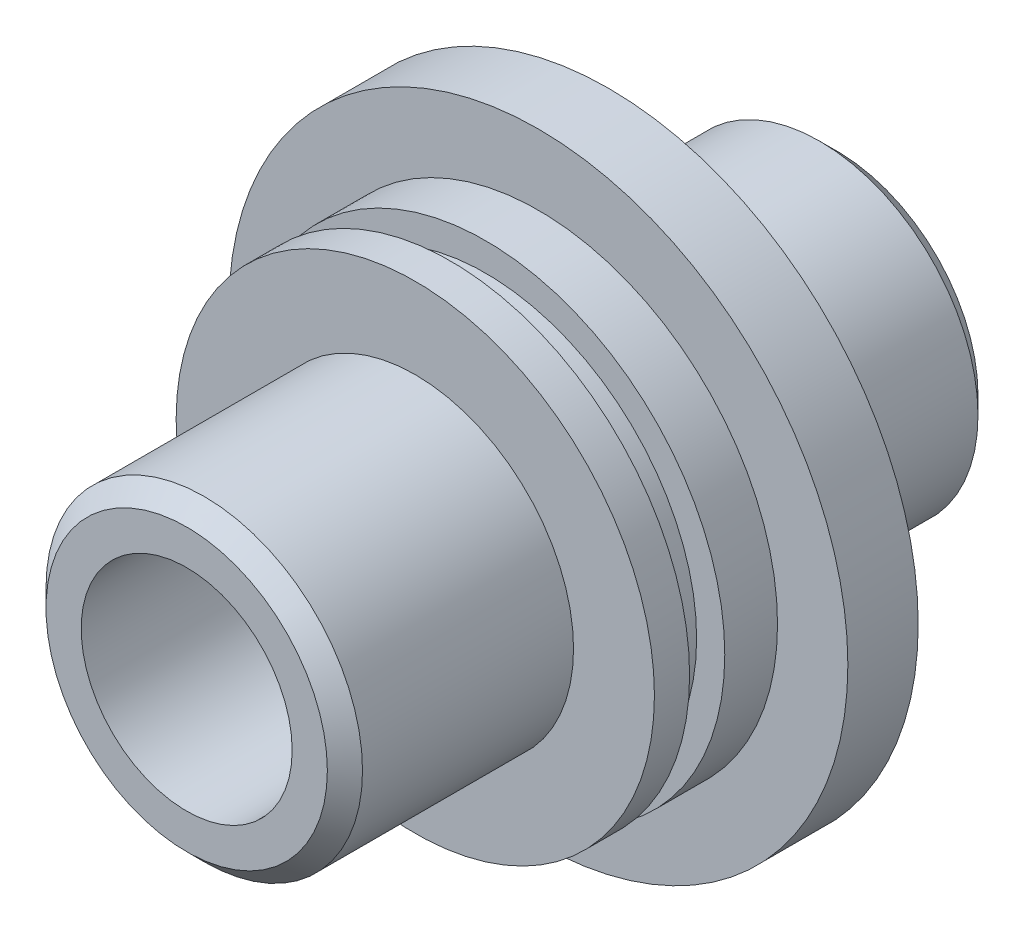
ISO-10303-21;
HEADER;
FILE_DESCRIPTION(('STEP AP214'),'2;1');
FILE_NAME('part.step','',(''),(''),'','','');
FILE_SCHEMA(('AUTOMOTIVE_DESIGN { 1 0 10303 214 1 1 1 1 }'));
ENDSEC;
DATA;
#1=APPLICATION_CONTEXT('core data for automotive mechanical design processes');
#2=APPLICATION_PROTOCOL_DEFINITION('international standard','automotive_design',2000,#1);
#3=PRODUCT_CONTEXT('',#1,'mechanical');
#4=PRODUCT('Part','Part','',(#3));
#5=PRODUCT_RELATED_PRODUCT_CATEGORY('part','',(#4));
#6=PRODUCT_DEFINITION_FORMATION('','',#4);
#7=PRODUCT_DEFINITION_CONTEXT('part definition',#1,'design');
#8=PRODUCT_DEFINITION('design','',#6,#7);
#9=PRODUCT_DEFINITION_SHAPE('','',#8);
#10=(LENGTH_UNIT() NAMED_UNIT(*) SI_UNIT(.MILLI.,.METRE.));
#11=(NAMED_UNIT(*) PLANE_ANGLE_UNIT() SI_UNIT($,.RADIAN.));
#12=(NAMED_UNIT(*) SI_UNIT($,.STERADIAN.) SOLID_ANGLE_UNIT());
#13=UNCERTAINTY_MEASURE_WITH_UNIT(LENGTH_MEASURE(1.E-05),#10,'distance_accuracy_value','');
#14=(GEOMETRIC_REPRESENTATION_CONTEXT(3) GLOBAL_UNCERTAINTY_ASSIGNED_CONTEXT((#13)) GLOBAL_UNIT_ASSIGNED_CONTEXT((#10,
#11,#12)) REPRESENTATION_CONTEXT('',''));
#15=CARTESIAN_POINT('',(0.,0.,0.));
#16=DIRECTION('',(0.,0.,1.));
#17=DIRECTION('',(1.,0.,0.));
#18=AXIS2_PLACEMENT_3D('',#15,#16,#17);
#19=CARTESIAN_POINT('',(0.,0.,-19.2374292795231));
#20=DIRECTION('',(0.,0.,1.));
#21=DIRECTION('',(1.,0.,0.));
#22=AXIS2_PLACEMENT_3D('',#19,#20,#21);
#23=CYLINDRICAL_SURFACE('',#22,6.8);
#24=CARTESIAN_POINT('',(0.,0.,8.5));
#25=DIRECTION('',(0.,0.,-1.));
#26=DIRECTION('',(-1.,0.,0.));
#27=AXIS2_PLACEMENT_3D('',#24,#25,#26);
#28=CIRCLE('',#27,6.8);
#29=CARTESIAN_POINT('',(-6.8,0.,8.5));
#30=VERTEX_POINT('',#29);
#31=EDGE_CURVE('E86',#30,#30,#28,.F.);
#32=ORIENTED_EDGE('',*,*,#31,.T.);
#33=EDGE_LOOP('',(#32));
#34=FACE_BOUND('',#33,.T.);
#35=CARTESIAN_POINT('',(0.,0.,10.));
#36=DIRECTION('',(0.,0.,1.));
#37=DIRECTION('',(1.,0.,0.));
#38=AXIS2_PLACEMENT_3D('',#35,#36,#37);
#39=CIRCLE('',#38,6.8);
#40=CARTESIAN_POINT('',(6.8,0.,10.));
#41=VERTEX_POINT('',#40);
#42=EDGE_CURVE('E71',#41,#41,#39,.F.);
#43=ORIENTED_EDGE('',*,*,#42,.T.);
#44=EDGE_LOOP('',(#43));
#45=FACE_BOUND('',#44,.T.);
#46=ADVANCED_FACE('F45',(#34,#45),#23,.T.);
#47=CARTESIAN_POINT('',(0.,0.,12.));
#48=DIRECTION('',(0.,0.,1.));
#49=DIRECTION('',(1.,0.,0.));
#50=AXIS2_PLACEMENT_3D('',#47,#48,#49);
#51=PLANE('',#50);
#52=CARTESIAN_POINT('',(0.,0.,12.));
#53=DIRECTION('',(0.,0.,1.));
#54=DIRECTION('',(1.,0.,0.));
#55=AXIS2_PLACEMENT_3D('',#52,#53,#54);
#56=CIRCLE('',#55,4.5);
#57=CARTESIAN_POINT('',(4.5,0.,12.));
#58=VERTEX_POINT('',#57);
#59=EDGE_CURVE('E91',#58,#58,#56,.T.);
#60=ORIENTED_EDGE('',*,*,#59,.F.);
#61=EDGE_LOOP('',(#60));
#62=FACE_BOUND('',#61,.T.);
#63=CARTESIAN_POINT('',(0.,0.,12.));
#64=DIRECTION('',(0.,0.,1.));
#65=DIRECTION('',(1.,0.,0.));
#66=AXIS2_PLACEMENT_3D('',#63,#64,#65);
#67=CIRCLE('',#66,6.8);
#68=CARTESIAN_POINT('',(6.8,0.,12.));
#69=VERTEX_POINT('',#68);
#70=EDGE_CURVE('E75',#69,#69,#67,.T.);
#71=ORIENTED_EDGE('',*,*,#70,.T.);
#72=EDGE_LOOP('',(#71));
#73=FACE_BOUND('',#72,.T.);
#74=ADVANCED_FACE('F140',(#62,#73),#51,.T.);
#75=CARTESIAN_POINT('',(0.,0.,18.5));
#76=DIRECTION('',(0.,0.,-1.));
#77=DIRECTION('',(-1.,0.,0.));
#78=AXIS2_PLACEMENT_3D('',#75,#76,#77);
#79=CYLINDRICAL_SURFACE('',#78,8.8);
#80=CARTESIAN_POINT('',(0.,0.,8.5));
#81=DIRECTION('',(0.,0.,-1.));
#82=DIRECTION('',(-1.,0.,0.));
#83=AXIS2_PLACEMENT_3D('',#80,#81,#82);
#84=CIRCLE('',#83,8.8);
#85=CARTESIAN_POINT('',(-8.8,0.,8.5));
#86=VERTEX_POINT('',#85);
#87=EDGE_CURVE('E81',#86,#86,#84,.T.);
#88=ORIENTED_EDGE('',*,*,#87,.T.);
#89=EDGE_LOOP('',(#88));
#90=FACE_BOUND('',#89,.T.);
#91=CARTESIAN_POINT('',(0.,0.,6.5));
#92=DIRECTION('',(0.,0.,-1.));
#93=DIRECTION('',(-1.,0.,0.));
#94=AXIS2_PLACEMENT_3D('',#91,#92,#93);
#95=CIRCLE('',#94,8.8);
#96=CARTESIAN_POINT('',(-8.8,0.,6.5));
#97=VERTEX_POINT('',#96);
#98=EDGE_CURVE('E87',#97,#97,#95,.T.);
#99=ORIENTED_EDGE('',*,*,#98,.F.);
#100=EDGE_LOOP('',(#99));
#101=FACE_BOUND('',#100,.T.);
#102=ADVANCED_FACE('F145',(#90,#101),#79,.T.);
#103=CARTESIAN_POINT('',(0.,0.,0.));
#104=DIRECTION('',(0.,0.,1.));
#105=DIRECTION('',(1.,0.,0.));
#106=AXIS2_PLACEMENT_3D('',#103,#104,#105);
#107=PLANE('',#106);
#108=CARTESIAN_POINT('',(0.,0.,0.));
#109=DIRECTION('',(0.,0.,1.));
#110=DIRECTION('',(1.,0.,0.));
#111=AXIS2_PLACEMENT_3D('',#108,#109,#110);
#112=CIRCLE('',#111,4.00000000000002);
#113=CARTESIAN_POINT('',(4.00000000000002,0.,0.));
#114=VERTEX_POINT('',#113);
#115=EDGE_CURVE('E54',#114,#114,#112,.F.);
#116=ORIENTED_EDGE('',*,*,#115,.T.);
#117=EDGE_LOOP('',(#116));
#118=FACE_BOUND('',#117,.T.);
#119=CARTESIAN_POINT('',(0.,0.,0.));
#120=DIRECTION('',(0.,0.,1.));
#121=DIRECTION('',(1.,0.,0.));
#122=AXIS2_PLACEMENT_3D('',#119,#120,#121);
#123=CIRCLE('',#122,3.);
#124=CARTESIAN_POINT('',(3.,0.,0.));
#125=VERTEX_POINT('',#124);
#126=EDGE_CURVE('E92',#125,#125,#123,.T.);
#127=ORIENTED_EDGE('',*,*,#126,.T.);
#128=EDGE_LOOP('',(#127));
#129=FACE_BOUND('',#128,.T.);
#130=ADVANCED_FACE('F171',(#118,#129),#107,.F.);
#131=CARTESIAN_POINT('',(0.,0.,18.5));
#132=DIRECTION('',(0.,0.,1.));
#133=DIRECTION('',(1.,0.,0.));
#134=AXIS2_PLACEMENT_3D('',#131,#132,#133);
#135=PLANE('',#134);
#136=CARTESIAN_POINT('',(0.,0.,18.5));
#137=DIRECTION('',(0.,0.,1.));
#138=DIRECTION('',(1.,0.,0.));
#139=AXIS2_PLACEMENT_3D('',#136,#137,#138);
#140=CIRCLE('',#139,4.00000000000002);
#141=CARTESIAN_POINT('',(4.00000000000002,0.,18.5));
#142=VERTEX_POINT('',#141);
#143=EDGE_CURVE('E64',#142,#142,#140,.T.);
#144=ORIENTED_EDGE('',*,*,#143,.T.);
#145=EDGE_LOOP('',(#144));
#146=FACE_BOUND('',#145,.T.);
#147=CARTESIAN_POINT('',(0.,0.,18.5));
#148=DIRECTION('',(0.,0.,1.));
#149=DIRECTION('',(1.,0.,0.));
#150=AXIS2_PLACEMENT_3D('',#147,#148,#149);
#151=CIRCLE('',#150,3.);
#152=CARTESIAN_POINT('',(3.,0.,18.5));
#153=VERTEX_POINT('',#152);
#154=EDGE_CURVE('E70',#153,#153,#151,.T.);
#155=ORIENTED_EDGE('',*,*,#154,.F.);
#156=EDGE_LOOP('',(#155));
#157=FACE_BOUND('',#156,.T.);
#158=ADVANCED_FACE('F167',(#146,#157),#135,.T.);
#159=CARTESIAN_POINT('',(0.,0.,18.5));
#160=DIRECTION('',(0.,0.,-1.));
#161=DIRECTION('',(-1.,0.,0.));
#162=AXIS2_PLACEMENT_3D('',#159,#160,#161);
#163=CYLINDRICAL_SURFACE('',#162,3.);
#164=ORIENTED_EDGE('',*,*,#154,.T.);
#165=EDGE_LOOP('',(#164));
#166=FACE_BOUND('',#165,.T.);
#167=ORIENTED_EDGE('',*,*,#126,.F.);
#168=EDGE_LOOP('',(#167));
#169=FACE_BOUND('',#168,.T.);
#170=ADVANCED_FACE('F162',(#166,#169),#163,.F.);
#171=CARTESIAN_POINT('',(0.,0.,12.));
#172=DIRECTION('',(0.,0.,1.));
#173=DIRECTION('',(1.,0.,0.));
#174=AXIS2_PLACEMENT_3D('',#171,#172,#173);
#175=CYLINDRICAL_SURFACE('',#174,4.5);
#176=CARTESIAN_POINT('',(0.,0.,18.));
#177=DIRECTION('',(0.,0.,1.));
#178=DIRECTION('',(1.,0.,0.));
#179=AXIS2_PLACEMENT_3D('',#176,#177,#178);
#180=CIRCLE('',#179,4.5);
#181=CARTESIAN_POINT('',(4.5,0.,18.));
#182=VERTEX_POINT('',#181);
#183=EDGE_CURVE('E59',#182,#182,#180,.F.);
#184=CARTESIAN_POINT('',(4.5,0.,18.));
#185=CARTESIAN_POINT('',(4.5,0.,17.9375));
#186=CARTESIAN_POINT('',(4.5,0.,17.875));
#187=CARTESIAN_POINT('',(4.5,0.,17.75));
#188=CARTESIAN_POINT('',(4.5,0.,17.6875));
#189=CARTESIAN_POINT('',(4.5,0.,17.5625));
#190=CARTESIAN_POINT('',(4.5,0.,17.5));
#191=CARTESIAN_POINT('',(4.5,0.,17.375));
#192=CARTESIAN_POINT('',(4.5,0.,17.3125));
#193=CARTESIAN_POINT('',(4.5,0.,17.1875));
#194=CARTESIAN_POINT('',(4.5,0.,17.125));
#195=CARTESIAN_POINT('',(4.5,0.,17.));
#196=CARTESIAN_POINT('',(4.5,0.,16.9375));
#197=CARTESIAN_POINT('',(4.5,0.,16.8125));
#198=CARTESIAN_POINT('',(4.5,0.,16.75));
#199=CARTESIAN_POINT('',(4.5,0.,16.625));
#200=CARTESIAN_POINT('',(4.5,0.,16.5625));
#201=CARTESIAN_POINT('',(4.5,0.,16.4375));
#202=CARTESIAN_POINT('',(4.5,0.,16.375));
#203=CARTESIAN_POINT('',(4.5,0.,16.25));
#204=CARTESIAN_POINT('',(4.5,0.,16.1875));
#205=CARTESIAN_POINT('',(4.5,0.,16.0625));
#206=CARTESIAN_POINT('',(4.5,0.,16.));
#207=CARTESIAN_POINT('',(4.5,0.,15.875));
#208=CARTESIAN_POINT('',(4.5,0.,15.8125));
#209=CARTESIAN_POINT('',(4.5,0.,15.6875));
#210=CARTESIAN_POINT('',(4.5,0.,15.625));
#211=CARTESIAN_POINT('',(4.5,0.,15.5));
#212=CARTESIAN_POINT('',(4.5,0.,15.4375));
#213=CARTESIAN_POINT('',(4.5,0.,15.3125));
#214=CARTESIAN_POINT('',(4.5,0.,15.25));
#215=CARTESIAN_POINT('',(4.5,0.,15.125));
#216=CARTESIAN_POINT('',(4.5,0.,15.0625));
#217=CARTESIAN_POINT('',(4.5,0.,14.9375));
#218=CARTESIAN_POINT('',(4.5,0.,14.875));
#219=CARTESIAN_POINT('',(4.5,0.,14.75));
#220=CARTESIAN_POINT('',(4.5,0.,14.6875));
#221=CARTESIAN_POINT('',(4.5,0.,14.5625));
#222=CARTESIAN_POINT('',(4.5,0.,14.5));
#223=CARTESIAN_POINT('',(4.5,0.,14.375));
#224=CARTESIAN_POINT('',(4.5,0.,14.3125));
#225=CARTESIAN_POINT('',(4.5,0.,14.1875));
#226=CARTESIAN_POINT('',(4.5,0.,14.125));
#227=CARTESIAN_POINT('',(4.5,0.,14.));
#228=CARTESIAN_POINT('',(4.5,0.,13.9375));
#229=CARTESIAN_POINT('',(4.5,0.,13.8125));
#230=CARTESIAN_POINT('',(4.5,0.,13.75));
#231=CARTESIAN_POINT('',(4.5,0.,13.625));
#232=CARTESIAN_POINT('',(4.5,0.,13.5625));
#233=CARTESIAN_POINT('',(4.5,0.,13.4375));
#234=CARTESIAN_POINT('',(4.5,0.,13.375));
#235=CARTESIAN_POINT('',(4.5,0.,13.25));
#236=CARTESIAN_POINT('',(4.5,0.,13.1875));
#237=CARTESIAN_POINT('',(4.5,0.,13.0625));
#238=CARTESIAN_POINT('',(4.5,0.,13.));
#239=CARTESIAN_POINT('',(4.5,0.,12.875));
#240=CARTESIAN_POINT('',(4.5,0.,12.8125));
#241=CARTESIAN_POINT('',(4.5,0.,12.6875));
#242=CARTESIAN_POINT('',(4.5,0.,12.625));
#243=CARTESIAN_POINT('',(4.5,0.,12.5));
#244=CARTESIAN_POINT('',(4.5,0.,12.4375));
#245=CARTESIAN_POINT('',(4.5,0.,12.3125));
#246=CARTESIAN_POINT('',(4.5,0.,12.25));
#247=CARTESIAN_POINT('',(4.5,0.,12.125));
#248=CARTESIAN_POINT('',(4.5,0.,12.0625));
#249=CARTESIAN_POINT('',(4.5,0.,12.));
#250=B_SPLINE_CURVE_WITH_KNOTS('',3,(#184,#185,#186,#187,#188,#189,#190,#191,#192,#193,#194,
#195,#196,#197,#198,#199,#200,#201,#202,#203,#204,#205,#206,#207,#208,#209,#210,#211,#212,#213,
#214,#215,#216,#217,#218,#219,#220,#221,#222,#223,#224,#225,#226,#227,#228,#229,#230,#231,#232,
#233,#234,#235,#236,#237,#238,#239,#240,#241,#242,#243,#244,#245,#246,#247,#248,#249),
.UNSPECIFIED.,.F.,.F.,(4,2,2,2,2,2,2,2,2,2,2,2,2,2,2,2,2,2,2,2,2,2,2,2,2,2,2,2,2,2,2,2,4),(0.,
0.187500000000004,0.375000000000004,0.562500000000004,0.750000000000004,0.937500000000004,1.125,
1.3125,1.5,1.6875,1.87500000000001,2.06250000000001,2.25000000000001,2.43750000000001,
2.62500000000001,2.81250000000001,3.00000000000001,3.18750000000001,3.37500000000001,
3.56250000000001,3.75000000000001,3.93750000000001,4.12500000000001,4.31250000000001,
4.50000000000002,4.68750000000002,4.87500000000002,5.06250000000002,5.25000000000002,
5.43750000000002,5.62500000000002,5.81250000000002,6.00000000000002),.UNSPECIFIED.);
#251=EDGE_CURVE('BSEAM159',#182,#58,#250,.T.);
#252=ORIENTED_EDGE('',*,*,#183,.T.);
#253=ORIENTED_EDGE('',*,*,#59,.T.);
#254=ORIENTED_EDGE('',*,*,#251,.T.);
#255=ORIENTED_EDGE('',*,*,#251,.F.);
#256=EDGE_LOOP('',(#252,#254,#253,#255));
#257=FACE_BOUND('',#256,.T.);
#258=ADVANCED_FACE('F159',(#257),#175,.T.);
#259=CARTESIAN_POINT('',(0.,0.,6.5));
#260=DIRECTION('',(0.,0.,-1.));
#261=DIRECTION('',(-1.,0.,0.));
#262=AXIS2_PLACEMENT_3D('',#259,#260,#261);
#263=PLANE('',#262);
#264=CARTESIAN_POINT('',(0.,0.,6.5));
#265=DIRECTION('',(0.,0.,-1.));
#266=DIRECTION('',(-1.,0.,0.));
#267=AXIS2_PLACEMENT_3D('',#264,#265,#266);
#268=CIRCLE('',#267,4.5);
#269=CARTESIAN_POINT('',(-4.5,0.,6.5));
#270=VERTEX_POINT('',#269);
#271=EDGE_CURVE('E85',#270,#270,#268,.T.);
#272=ORIENTED_EDGE('',*,*,#271,.F.);
#273=EDGE_LOOP('',(#272));
#274=FACE_BOUND('',#273,.T.);
#275=ORIENTED_EDGE('',*,*,#98,.T.);
#276=EDGE_LOOP('',(#275));
#277=FACE_BOUND('',#276,.T.);
#278=ADVANCED_FACE('F156',(#274,#277),#263,.T.);
#279=CARTESIAN_POINT('',(0.,0.,6.5));
#280=DIRECTION('',(0.,0.,-1.));
#281=DIRECTION('',(-1.,0.,0.));
#282=AXIS2_PLACEMENT_3D('',#279,#280,#281);
#283=CYLINDRICAL_SURFACE('',#282,4.5);
#284=CARTESIAN_POINT('',(0.,0.,0.499999999999981));
#285=DIRECTION('',(0.,0.,1.));
#286=DIRECTION('',(1.,0.,0.));
#287=AXIS2_PLACEMENT_3D('',#284,#285,#286);
#288=CIRCLE('',#287,4.5);
#289=CARTESIAN_POINT('',(-4.5,0.,0.499999999999981));
#290=VERTEX_POINT('',#289);
#291=EDGE_CURVE('E12',#290,#290,#288,.T.);
#292=CARTESIAN_POINT('',(-4.5,0.,0.499999999999981));
#293=CARTESIAN_POINT('',(-4.5,0.,0.562499999999981));
#294=CARTESIAN_POINT('',(-4.5,0.,0.624999999999981));
#295=CARTESIAN_POINT('',(-4.5,0.,0.749999999999982));
#296=CARTESIAN_POINT('',(-4.5,0.,0.812499999999982));
#297=CARTESIAN_POINT('',(-4.5,0.,0.937499999999983));
#298=CARTESIAN_POINT('',(-4.5,0.,0.999999999999983));
#299=CARTESIAN_POINT('',(-4.5,0.,1.12499999999998));
#300=CARTESIAN_POINT('',(-4.5,0.,1.18749999999998));
#301=CARTESIAN_POINT('',(-4.5,0.,1.31249999999998));
#302=CARTESIAN_POINT('',(-4.5,0.,1.37499999999998));
#303=CARTESIAN_POINT('',(-4.5,0.,1.49999999999998));
#304=CARTESIAN_POINT('',(-4.5,0.,1.56249999999998));
#305=CARTESIAN_POINT('',(-4.5,0.,1.68749999999999));
#306=CARTESIAN_POINT('',(-4.5,0.,1.74999999999999));
#307=CARTESIAN_POINT('',(-4.5,0.,1.87499999999999));
#308=CARTESIAN_POINT('',(-4.5,0.,1.93749999999999));
#309=CARTESIAN_POINT('',(-4.5,0.,2.06249999999999));
#310=CARTESIAN_POINT('',(-4.5,0.,2.12499999999999));
#311=CARTESIAN_POINT('',(-4.5,0.,2.24999999999999));
#312=CARTESIAN_POINT('',(-4.5,0.,2.31249999999999));
#313=CARTESIAN_POINT('',(-4.5,0.,2.43749999999999));
#314=CARTESIAN_POINT('',(-4.5,0.,2.49999999999999));
#315=CARTESIAN_POINT('',(-4.5,0.,2.62499999999999));
#316=CARTESIAN_POINT('',(-4.5,0.,2.68749999999999));
#317=CARTESIAN_POINT('',(-4.5,0.,2.81249999999999));
#318=CARTESIAN_POINT('',(-4.5,0.,2.87499999999999));
#319=CARTESIAN_POINT('',(-4.5,0.,2.99999999999999));
#320=CARTESIAN_POINT('',(-4.5,0.,3.06249999999999));
#321=CARTESIAN_POINT('',(-4.5,0.,3.18749999999999));
#322=CARTESIAN_POINT('',(-4.5,0.,3.24999999999999));
#323=CARTESIAN_POINT('',(-4.5,0.,3.37499999999999));
#324=CARTESIAN_POINT('',(-4.5,0.,3.43749999999999));
#325=CARTESIAN_POINT('',(-4.5,0.,3.56249999999999));
#326=CARTESIAN_POINT('',(-4.5,0.,3.62499999999999));
#327=CARTESIAN_POINT('',(-4.5,0.,3.74999999999999));
#328=CARTESIAN_POINT('',(-4.5,0.,3.81249999999999));
#329=CARTESIAN_POINT('',(-4.5,0.,3.93749999999999));
#330=CARTESIAN_POINT('',(-4.5,0.,3.99999999999999));
#331=CARTESIAN_POINT('',(-4.5,0.,4.12499999999999));
#332=CARTESIAN_POINT('',(-4.5,0.,4.18749999999999));
#333=CARTESIAN_POINT('',(-4.5,0.,4.31249999999999));
#334=CARTESIAN_POINT('',(-4.5,0.,4.37499999999999));
#335=CARTESIAN_POINT('',(-4.5,0.,4.49999999999999));
#336=CARTESIAN_POINT('',(-4.5,0.,4.56249999999999));
#337=CARTESIAN_POINT('',(-4.5,0.,4.68749999999999));
#338=CARTESIAN_POINT('',(-4.5,0.,4.74999999999999));
#339=CARTESIAN_POINT('',(-4.5,0.,4.87499999999999));
#340=CARTESIAN_POINT('',(-4.5,0.,4.93749999999999));
#341=CARTESIAN_POINT('',(-4.5,0.,5.06249999999999));
#342=CARTESIAN_POINT('',(-4.5,0.,5.12499999999999));
#343=CARTESIAN_POINT('',(-4.5,0.,5.25));
#344=CARTESIAN_POINT('',(-4.5,0.,5.3125));
#345=CARTESIAN_POINT('',(-4.5,0.,5.4375));
#346=CARTESIAN_POINT('',(-4.5,0.,5.5));
#347=CARTESIAN_POINT('',(-4.5,0.,5.625));
#348=CARTESIAN_POINT('',(-4.5,0.,5.6875));
#349=CARTESIAN_POINT('',(-4.5,0.,5.8125));
#350=CARTESIAN_POINT('',(-4.5,0.,5.875));
#351=CARTESIAN_POINT('',(-4.5,0.,6.));
#352=CARTESIAN_POINT('',(-4.5,0.,6.0625));
#353=CARTESIAN_POINT('',(-4.5,0.,6.1875));
#354=CARTESIAN_POINT('',(-4.5,0.,6.25));
#355=CARTESIAN_POINT('',(-4.5,0.,6.375));
#356=CARTESIAN_POINT('',(-4.5,0.,6.4375));
#357=CARTESIAN_POINT('',(-4.5,0.,6.5));
#358=B_SPLINE_CURVE_WITH_KNOTS('',3,(#292,#293,#294,#295,#296,#297,#298,#299,#300,#301,#302,
#303,#304,#305,#306,#307,#308,#309,#310,#311,#312,#313,#314,#315,#316,#317,#318,#319,#320,#321,
#322,#323,#324,#325,#326,#327,#328,#329,#330,#331,#332,#333,#334,#335,#336,#337,#338,#339,#340,
#341,#342,#343,#344,#345,#346,#347,#348,#349,#350,#351,#352,#353,#354,#355,#356,#357),
.UNSPECIFIED.,.F.,.F.,(4,2,2,2,2,2,2,2,2,2,2,2,2,2,2,2,2,2,2,2,2,2,2,2,2,2,2,2,2,2,2,2,4),(0.,
0.1875,0.375000000000001,0.562500000000002,0.750000000000002,0.937500000000003,1.125,1.3125,1.5,
1.6875,1.87500000000001,2.06250000000001,2.25000000000001,2.43750000000001,2.62500000000001,
2.81250000000001,3.00000000000001,3.18750000000001,3.37500000000001,3.56250000000001,
3.75000000000001,3.93750000000001,4.12500000000001,4.31250000000001,4.50000000000001,
4.68750000000001,4.87500000000002,5.06250000000002,5.25000000000002,5.43750000000002,
5.62500000000002,5.81250000000002,6.00000000000002),.UNSPECIFIED.);
#359=EDGE_CURVE('BSEAM152',#290,#270,#358,.T.);
#360=ORIENTED_EDGE('',*,*,#291,.T.);
#361=ORIENTED_EDGE('',*,*,#271,.T.);
#362=ORIENTED_EDGE('',*,*,#359,.T.);
#363=ORIENTED_EDGE('',*,*,#359,.F.);
#364=EDGE_LOOP('',(#360,#362,#361,#363));
#365=FACE_BOUND('',#364,.T.);
#366=ADVANCED_FACE('F152',(#365),#283,.T.);
#367=CARTESIAN_POINT('',(0.,0.,8.5));
#368=DIRECTION('',(0.,0.,-1.));
#369=DIRECTION('',(-1.,0.,0.));
#370=AXIS2_PLACEMENT_3D('',#367,#368,#369);
#371=PLANE('',#370);
#372=ORIENTED_EDGE('',*,*,#31,.F.);
#373=EDGE_LOOP('',(#372));
#374=FACE_BOUND('',#373,.T.);
#375=ORIENTED_EDGE('',*,*,#87,.F.);
#376=EDGE_LOOP('',(#375));
#377=FACE_BOUND('',#376,.T.);
#378=ADVANCED_FACE('F134',(#374,#377),#371,.F.);
#379=CARTESIAN_POINT('',(0.,0.,11.));
#380=DIRECTION('',(0.,0.,1.));
#381=DIRECTION('',(1.,0.,0.));
#382=AXIS2_PLACEMENT_3D('',#379,#380,#381);
#383=CIRCLE('',#382,6.8);
#384=CARTESIAN_POINT('',(6.8,0.,11.));
#385=VERTEX_POINT('',#384);
#386=EDGE_CURVE('E76',#385,#385,#383,.F.);
#387=ORIENTED_EDGE('',*,*,#386,.F.);
#388=EDGE_LOOP('',(#387));
#389=FACE_BOUND('',#388,.T.);
#390=ORIENTED_EDGE('',*,*,#70,.F.);
#391=EDGE_LOOP('',(#390));
#392=FACE_BOUND('',#391,.T.);
#393=ADVANCED_FACE('F125',(#389,#392),#23,.T.);
#394=CARTESIAN_POINT('',(0.,0.,10.));
#395=DIRECTION('',(0.,0.,1.));
#396=DIRECTION('',(1.,0.,0.));
#397=AXIS2_PLACEMENT_3D('',#394,#395,#396);
#398=PLANE('',#397);
#399=ORIENTED_EDGE('',*,*,#42,.F.);
#400=EDGE_LOOP('',(#399));
#401=FACE_BOUND('',#400,.T.);
#402=CARTESIAN_POINT('',(0.,0.,10.));
#403=DIRECTION('',(0.,0.,1.));
#404=DIRECTION('',(1.,0.,0.));
#405=AXIS2_PLACEMENT_3D('',#402,#403,#404);
#406=CIRCLE('',#405,6.);
#407=CARTESIAN_POINT('',(6.,0.,10.));
#408=VERTEX_POINT('',#407);
#409=EDGE_CURVE('E80',#408,#408,#406,.T.);
#410=ORIENTED_EDGE('',*,*,#409,.F.);
#411=EDGE_LOOP('',(#410));
#412=FACE_BOUND('',#411,.T.);
#413=ADVANCED_FACE('F122',(#401,#412),#398,.T.);
#414=CARTESIAN_POINT('',(0.,0.,11.));
#415=DIRECTION('',(0.,0.,1.));
#416=DIRECTION('',(1.,0.,0.));
#417=AXIS2_PLACEMENT_3D('',#414,#415,#416);
#418=PLANE('',#417);
#419=ORIENTED_EDGE('',*,*,#386,.T.);
#420=EDGE_LOOP('',(#419));
#421=FACE_BOUND('',#420,.T.);
#422=CARTESIAN_POINT('',(0.,0.,11.));
#423=DIRECTION('',(0.,0.,1.));
#424=DIRECTION('',(1.,0.,0.));
#425=AXIS2_PLACEMENT_3D('',#422,#423,#424);
#426=CIRCLE('',#425,6.);
#427=CARTESIAN_POINT('',(6.,0.,11.));
#428=VERTEX_POINT('',#427);
#429=EDGE_CURVE('E111',#428,#428,#426,.T.);
#430=ORIENTED_EDGE('',*,*,#429,.T.);
#431=EDGE_LOOP('',(#430));
#432=FACE_BOUND('',#431,.T.);
#433=ADVANCED_FACE('F124',(#421,#432),#418,.F.);
#434=CARTESIAN_POINT('',(0.,0.,10.));
#435=DIRECTION('',(0.,0.,1.));
#436=DIRECTION('',(1.,0.,0.));
#437=AXIS2_PLACEMENT_3D('',#434,#435,#436);
#438=CYLINDRICAL_SURFACE('',#437,6.);
#439=ORIENTED_EDGE('',*,*,#409,.T.);
#440=EDGE_LOOP('',(#439));
#441=FACE_BOUND('',#440,.T.);
#442=ORIENTED_EDGE('',*,*,#429,.F.);
#443=EDGE_LOOP('',(#442));
#444=FACE_BOUND('',#443,.T.);
#445=ADVANCED_FACE('F119',(#441,#444),#438,.T.);
#446=CARTESIAN_POINT('',(0.,0.,18.5));
#447=DIRECTION('',(0.,0.,-1.));
#448=DIRECTION('',(-1.,0.,0.));
#449=AXIS2_PLACEMENT_3D('',#446,#447,#448);
#450=CONICAL_SURFACE('',#449,4.00000000000002,0.785398163397452);
#451=ORIENTED_EDGE('',*,*,#183,.F.);
#452=EDGE_LOOP('',(#451));
#453=FACE_BOUND('',#452,.T.);
#454=ORIENTED_EDGE('',*,*,#143,.F.);
#455=EDGE_LOOP('',(#454));
#456=FACE_BOUND('',#455,.T.);
#457=ADVANCED_FACE('F178',(#453,#456),#450,.T.);
#458=CARTESIAN_POINT('',(0.,0.,0.));
#459=DIRECTION('',(0.,0.,1.));
#460=DIRECTION('',(1.,0.,0.));
#461=AXIS2_PLACEMENT_3D('',#458,#459,#460);
#462=CONICAL_SURFACE('',#461,4.00000000000002,0.78539816339745);
#463=ORIENTED_EDGE('',*,*,#291,.F.);
#464=EDGE_LOOP('',(#463));
#465=FACE_BOUND('',#464,.T.);
#466=ORIENTED_EDGE('',*,*,#115,.F.);
#467=EDGE_LOOP('',(#466));
#468=FACE_BOUND('',#467,.T.);
#469=ADVANCED_FACE('F48',(#465,#468),#462,.T.);
#470=CLOSED_SHELL('',(#46,#74,#102,#130,#158,#170,#258,#278,#366,#378,#393,#413,#433,#445,#457,#469));
#471=MANIFOLD_SOLID_BREP('B2',#470);
#472=ADVANCED_BREP_SHAPE_REPRESENTATION('',(#18,#471),#14);
#473=SHAPE_DEFINITION_REPRESENTATION(#9,#472);
ENDSEC;
END-ISO-10303-21;
